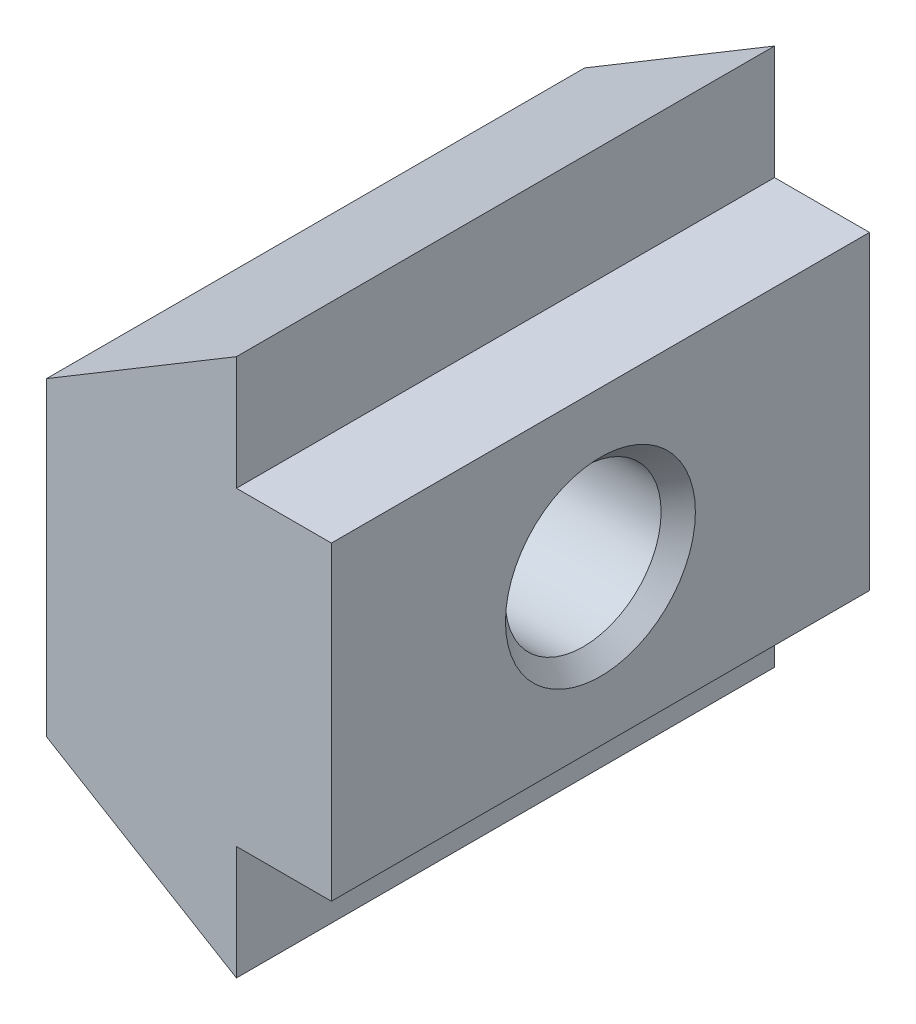
ISO-10303-21;
HEADER;
FILE_DESCRIPTION(('STEP AP214'),'2;1');
FILE_NAME('part.step','',(''),(''),'','','');
FILE_SCHEMA(('AUTOMOTIVE_DESIGN { 1 0 10303 214 1 1 1 1 }'));
ENDSEC;
DATA;
#1=APPLICATION_CONTEXT('core data for automotive mechanical design processes');
#2=APPLICATION_PROTOCOL_DEFINITION('international standard','automotive_design',2000,#1);
#3=PRODUCT_CONTEXT('',#1,'mechanical');
#4=PRODUCT('Part','Part','',(#3));
#5=PRODUCT_RELATED_PRODUCT_CATEGORY('part','',(#4));
#6=PRODUCT_DEFINITION_FORMATION('','',#4);
#7=PRODUCT_DEFINITION_CONTEXT('part definition',#1,'design');
#8=PRODUCT_DEFINITION('design','',#6,#7);
#9=PRODUCT_DEFINITION_SHAPE('','',#8);
#10=(LENGTH_UNIT() NAMED_UNIT(*) SI_UNIT(.MILLI.,.METRE.));
#11=(NAMED_UNIT(*) PLANE_ANGLE_UNIT() SI_UNIT($,.RADIAN.));
#12=(NAMED_UNIT(*) SI_UNIT($,.STERADIAN.) SOLID_ANGLE_UNIT());
#13=UNCERTAINTY_MEASURE_WITH_UNIT(LENGTH_MEASURE(1.E-05),#10,'distance_accuracy_value','');
#14=(GEOMETRIC_REPRESENTATION_CONTEXT(3) GLOBAL_UNCERTAINTY_ASSIGNED_CONTEXT((#13)) GLOBAL_UNIT_ASSIGNED_CONTEXT((#10,
#11,#12)) REPRESENTATION_CONTEXT('',''));
#15=CARTESIAN_POINT('',(0.,0.,0.));
#16=DIRECTION('',(0.,0.,1.));
#17=DIRECTION('',(1.,0.,0.));
#18=AXIS2_PLACEMENT_3D('',#15,#16,#17);
#19=CARTESIAN_POINT('',(-8.99999999990087,0.,0.));
#20=DIRECTION('',(-1.,0.,0.));
#21=DIRECTION('',(0.,0.,1.));
#22=AXIS2_PLACEMENT_3D('',#19,#20,#21);
#23=CONICAL_SURFACE('',#22,2.99999999992906,0.785398163397448);
#24=CARTESIAN_POINT('',(-8.99999999995771,0.,0.));
#25=DIRECTION('',(-1.,0.,0.));
#26=DIRECTION('',(0.,0.,1.));
#27=AXIS2_PLACEMENT_3D('',#24,#25,#26);
#28=CIRCLE('',#27,2.9999999999859);
#29=CARTESIAN_POINT('',(-8.99999999995771,0.,2.9999999999859));
#30=VERTEX_POINT('',#29);
#31=EDGE_CURVE('E20',#30,#30,#28,.T.);
#32=ORIENTED_EDGE('',*,*,#31,.T.);
#33=EDGE_LOOP('',(#32));
#34=FACE_BOUND('',#33,.T.);
#35=CARTESIAN_POINT('',(-8.4585,0.,0.));
#36=DIRECTION('',(-1.,0.,0.));
#37=DIRECTION('',(0.,0.,1.));
#38=AXIS2_PLACEMENT_3D('',#35,#36,#37);
#39=CIRCLE('',#38,2.4585);
#40=CARTESIAN_POINT('',(-8.4585,0.,2.4585));
#41=VERTEX_POINT('',#40);
#42=EDGE_CURVE('E94',#41,#41,#39,.F.);
#43=ORIENTED_EDGE('',*,*,#42,.T.);
#44=EDGE_LOOP('',(#43));
#45=FACE_BOUND('',#44,.T.);
#46=ADVANCED_FACE('F17',(#34,#45),#23,.F.);
#47=CARTESIAN_POINT('',(-9.,4.9,8.5));
#48=DIRECTION('',(1.,0.,0.));
#49=DIRECTION('',(0.,0.,-1.));
#50=AXIS2_PLACEMENT_3D('',#47,#48,#49);
#51=PLANE('',#50);
#52=ORIENTED_EDGE('',*,*,#31,.F.);
#53=EDGE_LOOP('',(#52));
#54=FACE_BOUND('',#53,.T.);
#55=DIRECTION('',(0.,0.,1.));
#56=VECTOR('',#55,1.);
#57=CARTESIAN_POINT('',(-9.,-4.9,8.5));
#58=LINE('',#57,#56);
#59=CARTESIAN_POINT('',(-9.,-4.9,-8.5));
#60=VERTEX_POINT('',#59);
#61=CARTESIAN_POINT('',(-9.,-4.9,8.5));
#62=VERTEX_POINT('',#61);
#63=EDGE_CURVE('E105',#60,#62,#58,.T.);
#64=ORIENTED_EDGE('',*,*,#63,.T.);
#65=DIRECTION('',(0.,1.,0.));
#66=VECTOR('',#65,1.);
#67=CARTESIAN_POINT('',(-9.,0.,8.5));
#68=LINE('',#67,#66);
#69=CARTESIAN_POINT('',(-9.,4.9,8.5));
#70=VERTEX_POINT('',#69);
#71=EDGE_CURVE('E99',#70,#62,#68,.F.);
#72=ORIENTED_EDGE('',*,*,#71,.F.);
#73=DIRECTION('',(0.,0.,1.));
#74=VECTOR('',#73,1.);
#75=CARTESIAN_POINT('',(-9.,4.9,8.5));
#76=LINE('',#75,#74);
#77=CARTESIAN_POINT('',(-9.,4.9,-8.5));
#78=VERTEX_POINT('',#77);
#79=EDGE_CURVE('E85',#70,#78,#76,.F.);
#80=ORIENTED_EDGE('',*,*,#79,.T.);
#81=DIRECTION('',(0.,1.,0.));
#82=VECTOR('',#81,1.);
#83=CARTESIAN_POINT('',(-9.,0.,-8.5));
#84=LINE('',#83,#82);
#85=EDGE_CURVE('E196',#78,#60,#84,.F.);
#86=ORIENTED_EDGE('',*,*,#85,.T.);
#87=EDGE_LOOP('',(#64,#72,#80,#86));
#88=FACE_BOUND('',#87,.T.);
#89=ADVANCED_FACE('F104',(#54,#88),#51,.F.);
#90=CARTESIAN_POINT('',(-9.,-4.9,8.5));
#91=DIRECTION('',(0.514495755427526,0.857492925712544,0.));
#92=DIRECTION('',(-0.857492925712544,0.514495755427526,0.));
#93=AXIS2_PLACEMENT_3D('',#90,#91,#92);
#94=PLANE('',#93);
#95=DIRECTION('',(0.,0.,1.));
#96=VECTOR('',#95,1.);
#97=CARTESIAN_POINT('',(-3.,-8.5,8.5));
#98=LINE('',#97,#96);
#99=CARTESIAN_POINT('',(-3.,-8.5,-8.5));
#100=VERTEX_POINT('',#99);
#101=CARTESIAN_POINT('',(-3.,-8.5,8.5));
#102=VERTEX_POINT('',#101);
#103=EDGE_CURVE('E120',#100,#102,#98,.T.);
#104=ORIENTED_EDGE('',*,*,#103,.T.);
#105=DIRECTION('',(0.857492925712544,-0.514495755427526,0.));
#106=VECTOR('',#105,1.);
#107=CARTESIAN_POINT('',(-9.,-4.9,8.5));
#108=LINE('',#107,#106);
#109=EDGE_CURVE('E107',#62,#102,#108,.T.);
#110=ORIENTED_EDGE('',*,*,#109,.F.);
#111=ORIENTED_EDGE('',*,*,#63,.F.);
#112=DIRECTION('',(0.857492925712544,-0.514495755427526,0.));
#113=VECTOR('',#112,1.);
#114=CARTESIAN_POINT('',(-9.,-4.9,-8.5));
#115=LINE('',#114,#113);
#116=EDGE_CURVE('E198',#60,#100,#115,.T.);
#117=ORIENTED_EDGE('',*,*,#116,.T.);
#118=EDGE_LOOP('',(#104,#110,#111,#117));
#119=FACE_BOUND('',#118,.T.);
#120=ADVANCED_FACE('F129',(#119),#94,.F.);
#121=CARTESIAN_POINT('',(-3.,-8.5,8.5));
#122=DIRECTION('',(-1.,0.,0.));
#123=DIRECTION('',(0.,0.,1.));
#124=AXIS2_PLACEMENT_3D('',#121,#122,#123);
#125=PLANE('',#124);
#126=DIRECTION('',(0.,0.,1.));
#127=VECTOR('',#126,1.);
#128=CARTESIAN_POINT('',(-3.,-4.9,8.5));
#129=LINE('',#128,#127);
#130=CARTESIAN_POINT('',(-3.,-4.9,-8.5));
#131=VERTEX_POINT('',#130);
#132=CARTESIAN_POINT('',(-3.,-4.9,8.5));
#133=VERTEX_POINT('',#132);
#134=EDGE_CURVE('E102',#131,#133,#129,.T.);
#135=ORIENTED_EDGE('',*,*,#134,.T.);
#136=DIRECTION('',(0.,1.,0.));
#137=VECTOR('',#136,1.);
#138=CARTESIAN_POINT('',(-3.,0.,8.5));
#139=LINE('',#138,#137);
#140=EDGE_CURVE('E109',#102,#133,#139,.T.);
#141=ORIENTED_EDGE('',*,*,#140,.F.);
#142=ORIENTED_EDGE('',*,*,#103,.F.);
#143=DIRECTION('',(0.,1.,0.));
#144=VECTOR('',#143,1.);
#145=CARTESIAN_POINT('',(-3.,0.,-8.5));
#146=LINE('',#145,#144);
#147=EDGE_CURVE('E181',#100,#131,#146,.T.);
#148=ORIENTED_EDGE('',*,*,#147,.T.);
#149=EDGE_LOOP('',(#135,#141,#142,#148));
#150=FACE_BOUND('',#149,.T.);
#151=ADVANCED_FACE('F135',(#150),#125,.F.);
#152=CARTESIAN_POINT('',(-3.,4.9,8.5));
#153=DIRECTION('',(-1.,0.,0.));
#154=DIRECTION('',(0.,0.,1.));
#155=AXIS2_PLACEMENT_3D('',#152,#153,#154);
#156=PLANE('',#155);
#157=DIRECTION('',(0.,0.,1.));
#158=VECTOR('',#157,1.);
#159=CARTESIAN_POINT('',(-3.,8.5,8.5));
#160=LINE('',#159,#158);
#161=CARTESIAN_POINT('',(-3.,8.5,-8.5));
#162=VERTEX_POINT('',#161);
#163=CARTESIAN_POINT('',(-3.,8.5,8.5));
#164=VERTEX_POINT('',#163);
#165=EDGE_CURVE('E78',#162,#164,#160,.T.);
#166=ORIENTED_EDGE('',*,*,#165,.T.);
#167=DIRECTION('',(0.,1.,0.));
#168=VECTOR('',#167,1.);
#169=CARTESIAN_POINT('',(-3.,0.,8.5));
#170=LINE('',#169,#168);
#171=CARTESIAN_POINT('',(-3.,4.9,8.5));
#172=VERTEX_POINT('',#171);
#173=EDGE_CURVE('E101',#172,#164,#170,.T.);
#174=ORIENTED_EDGE('',*,*,#173,.F.);
#175=DIRECTION('',(0.,0.,-1.));
#176=VECTOR('',#175,1.);
#177=CARTESIAN_POINT('',(-3.,4.9,8.5));
#178=LINE('',#177,#176);
#179=CARTESIAN_POINT('',(-3.,4.9,-8.5));
#180=VERTEX_POINT('',#179);
#181=EDGE_CURVE('E194',#172,#180,#178,.T.);
#182=ORIENTED_EDGE('',*,*,#181,.T.);
#183=DIRECTION('',(0.,1.,0.));
#184=VECTOR('',#183,1.);
#185=CARTESIAN_POINT('',(-3.,0.,-8.5));
#186=LINE('',#185,#184);
#187=EDGE_CURVE('E205',#180,#162,#186,.T.);
#188=ORIENTED_EDGE('',*,*,#187,.T.);
#189=EDGE_LOOP('',(#166,#174,#182,#188));
#190=FACE_BOUND('',#189,.T.);
#191=ADVANCED_FACE('F170',(#190),#156,.F.);
#192=CARTESIAN_POINT('',(-3.,8.5,8.5));
#193=DIRECTION('',(0.514495755427526,-0.857492925712544,0.));
#194=DIRECTION('',(0.857492925712544,0.514495755427526,0.));
#195=AXIS2_PLACEMENT_3D('',#192,#193,#194);
#196=PLANE('',#195);
#197=ORIENTED_EDGE('',*,*,#79,.F.);
#198=DIRECTION('',(-0.857492925712544,-0.514495755427526,0.));
#199=VECTOR('',#198,1.);
#200=CARTESIAN_POINT('',(-3.,8.5,8.5));
#201=LINE('',#200,#199);
#202=EDGE_CURVE('E88',#164,#70,#201,.T.);
#203=ORIENTED_EDGE('',*,*,#202,.F.);
#204=ORIENTED_EDGE('',*,*,#165,.F.);
#205=DIRECTION('',(-0.857492925712544,-0.514495755427526,0.));
#206=VECTOR('',#205,1.);
#207=CARTESIAN_POINT('',(-3.,8.5,-8.5));
#208=LINE('',#207,#206);
#209=EDGE_CURVE('E90',#162,#78,#208,.T.);
#210=ORIENTED_EDGE('',*,*,#209,.T.);
#211=EDGE_LOOP('',(#197,#203,#204,#210));
#212=FACE_BOUND('',#211,.T.);
#213=ADVANCED_FACE('F87',(#212),#196,.F.);
#214=CARTESIAN_POINT('',(0.,0.,0.));
#215=DIRECTION('',(-1.,0.,0.));
#216=DIRECTION('',(0.,0.,1.));
#217=AXIS2_PLACEMENT_3D('',#214,#215,#216);
#218=CYLINDRICAL_SURFACE('',#217,2.4585);
#219=ORIENTED_EDGE('',*,*,#42,.F.);
#220=EDGE_LOOP('',(#219));
#221=FACE_BOUND('',#220,.T.);
#222=CARTESIAN_POINT('',(-0.541499999997086,0.,0.));
#223=DIRECTION('',(1.,0.,0.));
#224=DIRECTION('',(0.,0.,-1.));
#225=AXIS2_PLACEMENT_3D('',#222,#223,#224);
#226=CIRCLE('',#225,2.45849999993197);
#227=CARTESIAN_POINT('',(-0.541499999997086,0.,-2.45849999993197));
#228=VERTEX_POINT('',#227);
#229=EDGE_CURVE('E208',#228,#228,#226,.T.);
#230=ORIENTED_EDGE('',*,*,#229,.T.);
#231=EDGE_LOOP('',(#230));
#232=FACE_BOUND('',#231,.T.);
#233=ADVANCED_FACE('F163',(#221,#232),#218,.F.);
#234=CARTESIAN_POINT('',(-3.,-4.9,8.5));
#235=DIRECTION('',(0.,1.,0.));
#236=DIRECTION('',(0.,0.,1.));
#237=AXIS2_PLACEMENT_3D('',#234,#235,#236);
#238=PLANE('',#237);
#239=DIRECTION('',(0.,0.,1.));
#240=VECTOR('',#239,1.);
#241=CARTESIAN_POINT('',(0.,-4.9,8.5));
#242=LINE('',#241,#240);
#243=CARTESIAN_POINT('',(0.,-4.9,-8.5));
#244=VERTEX_POINT('',#243);
#245=CARTESIAN_POINT('',(0.,-4.9,8.5));
#246=VERTEX_POINT('',#245);
#247=EDGE_CURVE('E186',#244,#246,#242,.T.);
#248=ORIENTED_EDGE('',*,*,#247,.T.);
#249=DIRECTION('',(1.,0.,0.));
#250=VECTOR('',#249,1.);
#251=CARTESIAN_POINT('',(0.,-4.9,8.5));
#252=LINE('',#251,#250);
#253=EDGE_CURVE('E185',#133,#246,#252,.T.);
#254=ORIENTED_EDGE('',*,*,#253,.F.);
#255=ORIENTED_EDGE('',*,*,#134,.F.);
#256=DIRECTION('',(1.,0.,0.));
#257=VECTOR('',#256,1.);
#258=CARTESIAN_POINT('',(0.,-4.9,-8.5));
#259=LINE('',#258,#257);
#260=EDGE_CURVE('E202',#131,#244,#259,.T.);
#261=ORIENTED_EDGE('',*,*,#260,.T.);
#262=EDGE_LOOP('',(#248,#254,#255,#261));
#263=FACE_BOUND('',#262,.T.);
#264=ADVANCED_FACE('F160',(#263),#238,.F.);
#265=CARTESIAN_POINT('',(0.,0.,8.5));
#266=DIRECTION('',(0.,0.,1.));
#267=DIRECTION('',(1.,0.,0.));
#268=AXIS2_PLACEMENT_3D('',#265,#266,#267);
#269=PLANE('',#268);
#270=DIRECTION('',(1.,0.,0.));
#271=VECTOR('',#270,1.);
#272=CARTESIAN_POINT('',(0.,4.9,8.5));
#273=LINE('',#272,#271);
#274=CARTESIAN_POINT('',(0.,4.9,8.5));
#275=VERTEX_POINT('',#274);
#276=EDGE_CURVE('E190',#275,#172,#273,.F.);
#277=ORIENTED_EDGE('',*,*,#276,.T.);
#278=ORIENTED_EDGE('',*,*,#173,.T.);
#279=ORIENTED_EDGE('',*,*,#202,.T.);
#280=ORIENTED_EDGE('',*,*,#71,.T.);
#281=ORIENTED_EDGE('',*,*,#109,.T.);
#282=ORIENTED_EDGE('',*,*,#140,.T.);
#283=ORIENTED_EDGE('',*,*,#253,.T.);
#284=DIRECTION('',(0.,1.,0.));
#285=VECTOR('',#284,1.);
#286=CARTESIAN_POINT('',(0.,-4.9,8.5));
#287=LINE('',#286,#285);
#288=EDGE_CURVE('E214',#246,#275,#287,.T.);
#289=ORIENTED_EDGE('',*,*,#288,.T.);
#290=EDGE_LOOP('',(#277,#278,#279,#280,#281,#282,#283,#289));
#291=FACE_BOUND('',#290,.T.);
#292=ADVANCED_FACE('F98',(#291),#269,.T.);
#293=CARTESIAN_POINT('',(0.,4.9,8.5));
#294=DIRECTION('',(0.,-1.,0.));
#295=DIRECTION('',(0.,0.,-1.));
#296=AXIS2_PLACEMENT_3D('',#293,#294,#295);
#297=PLANE('',#296);
#298=ORIENTED_EDGE('',*,*,#181,.F.);
#299=ORIENTED_EDGE('',*,*,#276,.F.);
#300=DIRECTION('',(0.,0.,1.));
#301=VECTOR('',#300,1.);
#302=CARTESIAN_POINT('',(0.,4.9,8.5));
#303=LINE('',#302,#301);
#304=CARTESIAN_POINT('',(0.,4.9,-8.5));
#305=VERTEX_POINT('',#304);
#306=EDGE_CURVE('E216',#275,#305,#303,.F.);
#307=ORIENTED_EDGE('',*,*,#306,.T.);
#308=DIRECTION('',(1.,0.,0.));
#309=VECTOR('',#308,1.);
#310=CARTESIAN_POINT('',(0.,4.9,-8.5));
#311=LINE('',#310,#309);
#312=EDGE_CURVE('E34',#305,#180,#311,.F.);
#313=ORIENTED_EDGE('',*,*,#312,.T.);
#314=EDGE_LOOP('',(#298,#299,#307,#313));
#315=FACE_BOUND('',#314,.T.);
#316=ADVANCED_FACE('F154',(#315),#297,.F.);
#317=CARTESIAN_POINT('',(0.,0.,-8.5));
#318=DIRECTION('',(0.,0.,1.));
#319=DIRECTION('',(1.,0.,0.));
#320=AXIS2_PLACEMENT_3D('',#317,#318,#319);
#321=PLANE('',#320);
#322=ORIENTED_EDGE('',*,*,#187,.F.);
#323=ORIENTED_EDGE('',*,*,#312,.F.);
#324=DIRECTION('',(0.,1.,0.));
#325=VECTOR('',#324,1.);
#326=CARTESIAN_POINT('',(0.,-4.9,-8.5));
#327=LINE('',#326,#325);
#328=EDGE_CURVE('E26',#305,#244,#327,.F.);
#329=ORIENTED_EDGE('',*,*,#328,.T.);
#330=ORIENTED_EDGE('',*,*,#260,.F.);
#331=ORIENTED_EDGE('',*,*,#147,.F.);
#332=ORIENTED_EDGE('',*,*,#116,.F.);
#333=ORIENTED_EDGE('',*,*,#85,.F.);
#334=ORIENTED_EDGE('',*,*,#209,.F.);
#335=EDGE_LOOP('',(#322,#323,#329,#330,#331,#332,#333,#334));
#336=FACE_BOUND('',#335,.T.);
#337=ADVANCED_FACE('F146',(#336),#321,.F.);
#338=CARTESIAN_POINT('',(-1.13686837721616E-10,0.,0.));
#339=DIRECTION('',(1.,0.,0.));
#340=DIRECTION('',(0.,0.,-1.));
#341=AXIS2_PLACEMENT_3D('',#338,#339,#340);
#342=CONICAL_SURFACE('',#341,2.99999999987222,0.785398163397448);
#343=ORIENTED_EDGE('',*,*,#229,.F.);
#344=EDGE_LOOP('',(#343));
#345=FACE_BOUND('',#344,.T.);
#346=CARTESIAN_POINT('',(0.,0.,0.));
#347=DIRECTION('',(1.,0.,0.));
#348=DIRECTION('',(0.,0.,-1.));
#349=AXIS2_PLACEMENT_3D('',#346,#347,#348);
#350=CIRCLE('',#349,2.9999999999859);
#351=CARTESIAN_POINT('',(0.,0.,-2.9999999999859));
#352=VERTEX_POINT('',#351);
#353=EDGE_CURVE('E11',#352,#352,#350,.T.);
#354=ORIENTED_EDGE('',*,*,#353,.T.);
#355=EDGE_LOOP('',(#354));
#356=FACE_BOUND('',#355,.T.);
#357=ADVANCED_FACE('F140',(#345,#356),#342,.F.);
#358=CARTESIAN_POINT('',(0.,-4.9,8.5));
#359=DIRECTION('',(-1.,0.,0.));
#360=DIRECTION('',(0.,0.,1.));
#361=AXIS2_PLACEMENT_3D('',#358,#359,#360);
#362=PLANE('',#361);
#363=ORIENTED_EDGE('',*,*,#353,.F.);
#364=EDGE_LOOP('',(#363));
#365=FACE_BOUND('',#364,.T.);
#366=ORIENTED_EDGE('',*,*,#306,.F.);
#367=ORIENTED_EDGE('',*,*,#288,.F.);
#368=ORIENTED_EDGE('',*,*,#247,.F.);
#369=ORIENTED_EDGE('',*,*,#328,.F.);
#370=EDGE_LOOP('',(#366,#367,#368,#369));
#371=FACE_BOUND('',#370,.T.);
#372=ADVANCED_FACE('F138',(#365,#371),#362,.F.);
#373=CLOSED_SHELL('',(#46,#89,#120,#151,#191,#213,#233,#264,#292,#316,#337,#357,#372));
#374=MANIFOLD_SOLID_BREP('B1',#373);
#375=ADVANCED_BREP_SHAPE_REPRESENTATION('',(#18,#374),#14);
#376=SHAPE_DEFINITION_REPRESENTATION(#9,#375);
ENDSEC;
END-ISO-10303-21;
